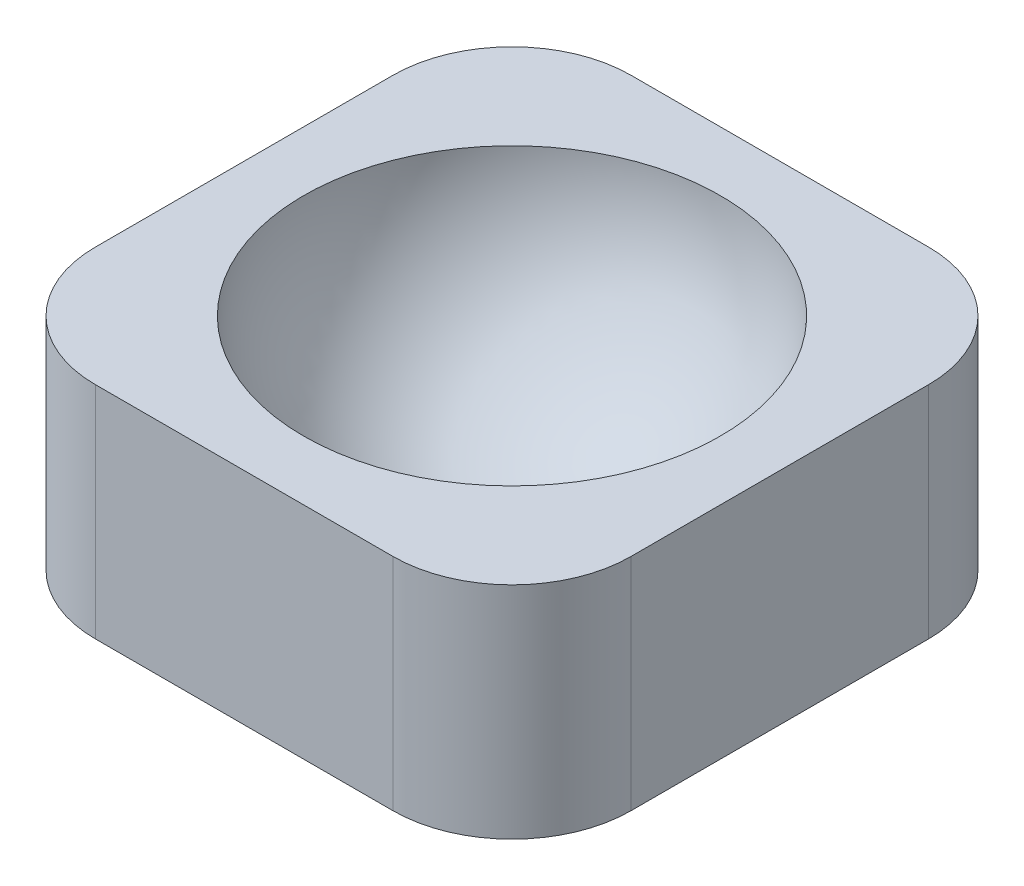
ISO-10303-21;
HEADER;
FILE_DESCRIPTION(('STEP AP214'),'2;1');
FILE_NAME('part.step','',(''),(''),'','','');
FILE_SCHEMA(('AUTOMOTIVE_DESIGN { 1 0 10303 214 1 1 1 1 }'));
ENDSEC;
DATA;
#1=APPLICATION_CONTEXT('core data for automotive mechanical design processes');
#2=APPLICATION_PROTOCOL_DEFINITION('international standard','automotive_design',2000,#1);
#3=PRODUCT_CONTEXT('',#1,'mechanical');
#4=PRODUCT('Part','Part','',(#3));
#5=PRODUCT_RELATED_PRODUCT_CATEGORY('part','',(#4));
#6=PRODUCT_DEFINITION_FORMATION('','',#4);
#7=PRODUCT_DEFINITION_CONTEXT('part definition',#1,'design');
#8=PRODUCT_DEFINITION('design','',#6,#7);
#9=PRODUCT_DEFINITION_SHAPE('','',#8);
#10=(LENGTH_UNIT() NAMED_UNIT(*) SI_UNIT(.MILLI.,.METRE.));
#11=(NAMED_UNIT(*) PLANE_ANGLE_UNIT() SI_UNIT($,.RADIAN.));
#12=(NAMED_UNIT(*) SI_UNIT($,.STERADIAN.) SOLID_ANGLE_UNIT());
#13=UNCERTAINTY_MEASURE_WITH_UNIT(LENGTH_MEASURE(1.E-05),#10,'distance_accuracy_value','');
#14=(GEOMETRIC_REPRESENTATION_CONTEXT(3) GLOBAL_UNCERTAINTY_ASSIGNED_CONTEXT((#13)) GLOBAL_UNIT_ASSIGNED_CONTEXT((#10,
#11,#12)) REPRESENTATION_CONTEXT('',''));
#15=CARTESIAN_POINT('',(0.,0.,0.));
#16=DIRECTION('',(0.,0.,1.));
#17=DIRECTION('',(1.,0.,0.));
#18=AXIS2_PLACEMENT_3D('',#15,#16,#17);
#19=CARTESIAN_POINT('',(-114.3,46.99,0.));
#20=DIRECTION('',(-1.,0.,0.));
#21=DIRECTION('',(0.,0.,1.));
#22=AXIS2_PLACEMENT_3D('',#19,#20,#21);
#23=PLANE('',#22);
#24=DIRECTION('',(0.,0.,-1.));
#25=VECTOR('',#24,1.);
#26=CARTESIAN_POINT('',(-114.3,0.,0.));
#27=LINE('',#26,#25);
#28=CARTESIAN_POINT('',(-114.3,0.,-25.4));
#29=VERTEX_POINT('',#28);
#30=CARTESIAN_POINT('',(-114.3,0.,-88.8999999999998));
#31=VERTEX_POINT('',#30);
#32=EDGE_CURVE('E132',#29,#31,#27,.T.);
#33=ORIENTED_EDGE('',*,*,#32,.F.);
#34=DIRECTION('',(0.,-1.,0.));
#35=VECTOR('',#34,1.);
#36=CARTESIAN_POINT('',(-114.3,46.99,-25.4));
#37=LINE('',#36,#35);
#38=CARTESIAN_POINT('',(-114.3,46.99,-25.4));
#39=VERTEX_POINT('',#38);
#40=EDGE_CURVE('E155',#29,#39,#37,.F.);
#41=ORIENTED_EDGE('',*,*,#40,.T.);
#42=DIRECTION('',(0.,0.,-1.));
#43=VECTOR('',#42,1.);
#44=CARTESIAN_POINT('',(-114.3,46.99,0.));
#45=LINE('',#44,#43);
#46=CARTESIAN_POINT('',(-114.3,46.99,-88.8999999999998));
#47=VERTEX_POINT('',#46);
#48=EDGE_CURVE('E130',#39,#47,#45,.T.);
#49=ORIENTED_EDGE('',*,*,#48,.T.);
#50=DIRECTION('',(0.,-1.,0.));
#51=VECTOR('',#50,1.);
#52=CARTESIAN_POINT('',(-114.3,0.,-88.8999999999998));
#53=LINE('',#52,#51);
#54=EDGE_CURVE('E152',#47,#31,#53,.T.);
#55=ORIENTED_EDGE('',*,*,#54,.T.);
#56=EDGE_LOOP('',(#33,#41,#49,#55));
#57=FACE_BOUND('',#56,.T.);
#58=ADVANCED_FACE('F37',(#57),#23,.T.);
#59=CARTESIAN_POINT('',(0.,46.99,0.));
#60=DIRECTION('',(0.,0.,1.));
#61=DIRECTION('',(1.,0.,0.));
#62=AXIS2_PLACEMENT_3D('',#59,#60,#61);
#63=PLANE('',#62);
#64=DIRECTION('',(-1.,0.,0.));
#65=VECTOR('',#64,1.);
#66=CARTESIAN_POINT('',(0.,0.,0.));
#67=LINE('',#66,#65);
#68=CARTESIAN_POINT('',(-25.4,0.,0.));
#69=VERTEX_POINT('',#68);
#70=CARTESIAN_POINT('',(-88.9000000000001,0.,0.));
#71=VERTEX_POINT('',#70);
#72=EDGE_CURVE('E128',#69,#71,#67,.T.);
#73=ORIENTED_EDGE('',*,*,#72,.F.);
#74=DIRECTION('',(0.,-1.,0.));
#75=VECTOR('',#74,1.);
#76=CARTESIAN_POINT('',(-25.4,46.99,0.));
#77=LINE('',#76,#75);
#78=CARTESIAN_POINT('',(-25.4,46.99,0.));
#79=VERTEX_POINT('',#78);
#80=EDGE_CURVE('E107',#69,#79,#77,.F.);
#81=ORIENTED_EDGE('',*,*,#80,.T.);
#82=DIRECTION('',(-1.,0.,0.));
#83=VECTOR('',#82,1.);
#84=CARTESIAN_POINT('',(0.,46.99,0.));
#85=LINE('',#84,#83);
#86=CARTESIAN_POINT('',(-88.9000000000001,46.99,0.));
#87=VERTEX_POINT('',#86);
#88=EDGE_CURVE('E171',#79,#87,#85,.T.);
#89=ORIENTED_EDGE('',*,*,#88,.T.);
#90=DIRECTION('',(0.,-1.,0.));
#91=VECTOR('',#90,1.);
#92=CARTESIAN_POINT('',(-88.9000000000001,46.99,0.));
#93=LINE('',#92,#91);
#94=EDGE_CURVE('E112',#87,#71,#93,.T.);
#95=ORIENTED_EDGE('',*,*,#94,.T.);
#96=EDGE_LOOP('',(#73,#81,#89,#95));
#97=FACE_BOUND('',#96,.T.);
#98=ADVANCED_FACE('F196',(#97),#63,.T.);
#99=CARTESIAN_POINT('',(0.,46.99,0.));
#100=DIRECTION('',(-1.,0.,0.));
#101=DIRECTION('',(0.,0.,1.));
#102=AXIS2_PLACEMENT_3D('',#99,#100,#101);
#103=PLANE('',#102);
#104=DIRECTION('',(0.,0.,-1.));
#105=VECTOR('',#104,1.);
#106=CARTESIAN_POINT('',(0.,46.99,0.));
#107=LINE('',#106,#105);
#108=CARTESIAN_POINT('',(0.,46.99,-25.4));
#109=VERTEX_POINT('',#108);
#110=CARTESIAN_POINT('',(0.,46.99,-88.8999999999999));
#111=VERTEX_POINT('',#110);
#112=EDGE_CURVE('E121',#109,#111,#107,.T.);
#113=ORIENTED_EDGE('',*,*,#112,.F.);
#114=DIRECTION('',(0.,-1.,0.));
#115=VECTOR('',#114,1.);
#116=CARTESIAN_POINT('',(0.,0.,-25.4));
#117=LINE('',#116,#115);
#118=CARTESIAN_POINT('',(0.,0.,-25.4));
#119=VERTEX_POINT('',#118);
#120=EDGE_CURVE('E106',#109,#119,#117,.T.);
#121=ORIENTED_EDGE('',*,*,#120,.T.);
#122=DIRECTION('',(0.,0.,-1.));
#123=VECTOR('',#122,1.);
#124=CARTESIAN_POINT('',(0.,0.,0.));
#125=LINE('',#124,#123);
#126=CARTESIAN_POINT('',(0.,0.,-88.8999999999999));
#127=VERTEX_POINT('',#126);
#128=EDGE_CURVE('E119',#119,#127,#125,.T.);
#129=ORIENTED_EDGE('',*,*,#128,.T.);
#130=DIRECTION('',(0.,-1.,0.));
#131=VECTOR('',#130,1.);
#132=CARTESIAN_POINT('',(0.,46.99,-88.8999999999999));
#133=LINE('',#132,#131);
#134=EDGE_CURVE('E123',#127,#111,#133,.F.);
#135=ORIENTED_EDGE('',*,*,#134,.T.);
#136=EDGE_LOOP('',(#113,#121,#129,#135));
#137=FACE_BOUND('',#136,.T.);
#138=ADVANCED_FACE('F118',(#137),#103,.F.);
#139=CARTESIAN_POINT('',(-1.52655665885959E-13,46.99,-114.3));
#140=DIRECTION('',(0.,0.,1.));
#141=DIRECTION('',(1.,0.,0.));
#142=AXIS2_PLACEMENT_3D('',#139,#140,#141);
#143=PLANE('',#142);
#144=DIRECTION('',(-1.,0.,0.));
#145=VECTOR('',#144,1.);
#146=CARTESIAN_POINT('',(-1.52655665885959E-13,0.,-114.3));
#147=LINE('',#146,#145);
#148=CARTESIAN_POINT('',(-25.4,0.,-114.3));
#149=VERTEX_POINT('',#148);
#150=CARTESIAN_POINT('',(-88.9000000000001,0.,-114.3));
#151=VERTEX_POINT('',#150);
#152=EDGE_CURVE('E127',#149,#151,#147,.T.);
#153=ORIENTED_EDGE('',*,*,#152,.T.);
#154=DIRECTION('',(0.,-1.,0.));
#155=VECTOR('',#154,1.);
#156=CARTESIAN_POINT('',(-88.9000000000001,46.99,-114.3));
#157=LINE('',#156,#155);
#158=CARTESIAN_POINT('',(-88.9000000000001,46.99,-114.3));
#159=VERTEX_POINT('',#158);
#160=EDGE_CURVE('E11',#151,#159,#157,.F.);
#161=ORIENTED_EDGE('',*,*,#160,.T.);
#162=DIRECTION('',(-1.,0.,0.));
#163=VECTOR('',#162,1.);
#164=CARTESIAN_POINT('',(-1.52655665885959E-13,46.99,-114.3));
#165=LINE('',#164,#163);
#166=CARTESIAN_POINT('',(-25.4,46.99,-114.3));
#167=VERTEX_POINT('',#166);
#168=EDGE_CURVE('E136',#167,#159,#165,.T.);
#169=ORIENTED_EDGE('',*,*,#168,.F.);
#170=DIRECTION('',(0.,-1.,0.));
#171=VECTOR('',#170,1.);
#172=CARTESIAN_POINT('',(-25.4,46.99,-114.3));
#173=LINE('',#172,#171);
#174=EDGE_CURVE('E45',#167,#149,#173,.T.);
#175=ORIENTED_EDGE('',*,*,#174,.T.);
#176=EDGE_LOOP('',(#153,#161,#169,#175));
#177=FACE_BOUND('',#176,.T.);
#178=ADVANCED_FACE('F158',(#177),#143,.F.);
#179=CARTESIAN_POINT('',(0.,46.99,0.));
#180=DIRECTION('',(0.,1.,0.));
#181=DIRECTION('',(0.,0.,1.));
#182=AXIS2_PLACEMENT_3D('',#179,#180,#181);
#183=PLANE('',#182);
#184=CARTESIAN_POINT('',(-57.15,46.99,-57.15));
#185=DIRECTION('',(0.,-1.,0.));
#186=DIRECTION('',(0.,0.,1.));
#187=AXIS2_PLACEMENT_3D('',#184,#185,#186);
#188=CIRCLE('',#187,44.45);
#189=CARTESIAN_POINT('',(-57.15,46.99,-12.7));
#190=VERTEX_POINT('',#189);
#191=EDGE_CURVE('E176',#190,#190,#188,.T.);
#192=ORIENTED_EDGE('',*,*,#191,.T.);
#193=EDGE_LOOP('',(#192));
#194=FACE_BOUND('',#193,.T.);
#195=ORIENTED_EDGE('',*,*,#88,.F.);
#196=CARTESIAN_POINT('',(-25.4,46.99,-25.4));
#197=DIRECTION('',(0.,1.,0.));
#198=DIRECTION('',(0.,0.,1.));
#199=AXIS2_PLACEMENT_3D('',#196,#197,#198);
#200=CIRCLE('',#199,25.4);
#201=EDGE_CURVE('E150',#79,#109,#200,.T.);
#202=ORIENTED_EDGE('',*,*,#201,.T.);
#203=ORIENTED_EDGE('',*,*,#112,.T.);
#204=CARTESIAN_POINT('',(-25.4,46.99,-88.8999999999999));
#205=DIRECTION('',(0.,1.,0.));
#206=DIRECTION('',(0.,0.,1.));
#207=AXIS2_PLACEMENT_3D('',#204,#205,#206);
#208=CIRCLE('',#207,25.4);
#209=EDGE_CURVE('E57',#111,#167,#208,.T.);
#210=ORIENTED_EDGE('',*,*,#209,.T.);
#211=ORIENTED_EDGE('',*,*,#168,.T.);
#212=CARTESIAN_POINT('',(-88.9000000000001,46.99,-88.8999999999998));
#213=DIRECTION('',(0.,1.,0.));
#214=DIRECTION('',(0.,0.,1.));
#215=AXIS2_PLACEMENT_3D('',#212,#213,#214);
#216=CIRCLE('',#215,25.4);
#217=EDGE_CURVE('E146',#159,#47,#216,.T.);
#218=ORIENTED_EDGE('',*,*,#217,.T.);
#219=ORIENTED_EDGE('',*,*,#48,.F.);
#220=CARTESIAN_POINT('',(-88.9000000000001,46.99,-25.4));
#221=DIRECTION('',(0.,1.,0.));
#222=DIRECTION('',(0.,0.,1.));
#223=AXIS2_PLACEMENT_3D('',#220,#221,#222);
#224=CIRCLE('',#223,25.4);
#225=EDGE_CURVE('E148',#39,#87,#224,.T.);
#226=ORIENTED_EDGE('',*,*,#225,.T.);
#227=EDGE_LOOP('',(#195,#202,#203,#210,#211,#218,#219,#226));
#228=FACE_BOUND('',#227,.T.);
#229=ADVANCED_FACE('F182',(#194,#228),#183,.T.);
#230=CARTESIAN_POINT('',(0.,0.,0.));
#231=DIRECTION('',(0.,1.,0.));
#232=DIRECTION('',(0.,0.,1.));
#233=AXIS2_PLACEMENT_3D('',#230,#231,#232);
#234=PLANE('',#233);
#235=ORIENTED_EDGE('',*,*,#128,.F.);
#236=CARTESIAN_POINT('',(-25.4,0.,-25.4));
#237=DIRECTION('',(0.,1.,0.));
#238=DIRECTION('',(0.,0.,1.));
#239=AXIS2_PLACEMENT_3D('',#236,#237,#238);
#240=CIRCLE('',#239,25.4);
#241=EDGE_CURVE('E102',#119,#69,#240,.F.);
#242=ORIENTED_EDGE('',*,*,#241,.T.);
#243=ORIENTED_EDGE('',*,*,#72,.T.);
#244=CARTESIAN_POINT('',(-88.9000000000001,0.,-25.4));
#245=DIRECTION('',(0.,1.,0.));
#246=DIRECTION('',(0.,0.,1.));
#247=AXIS2_PLACEMENT_3D('',#244,#245,#246);
#248=CIRCLE('',#247,25.4);
#249=EDGE_CURVE('E113',#71,#29,#248,.F.);
#250=ORIENTED_EDGE('',*,*,#249,.T.);
#251=ORIENTED_EDGE('',*,*,#32,.T.);
#252=CARTESIAN_POINT('',(-88.9000000000001,0.,-88.8999999999998));
#253=DIRECTION('',(0.,1.,0.));
#254=DIRECTION('',(0.,0.,1.));
#255=AXIS2_PLACEMENT_3D('',#252,#253,#254);
#256=CIRCLE('',#255,25.4);
#257=EDGE_CURVE('E139',#31,#151,#256,.F.);
#258=ORIENTED_EDGE('',*,*,#257,.T.);
#259=ORIENTED_EDGE('',*,*,#152,.F.);
#260=CARTESIAN_POINT('',(-25.4,0.,-88.8999999999999));
#261=DIRECTION('',(0.,1.,0.));
#262=DIRECTION('',(0.,0.,1.));
#263=AXIS2_PLACEMENT_3D('',#260,#261,#262);
#264=CIRCLE('',#263,25.4);
#265=EDGE_CURVE('E122',#149,#127,#264,.F.);
#266=ORIENTED_EDGE('',*,*,#265,.T.);
#267=EDGE_LOOP('',(#235,#242,#243,#250,#251,#258,#259,#266));
#268=FACE_BOUND('',#267,.T.);
#269=ADVANCED_FACE('F125',(#268),#234,.F.);
#270=CARTESIAN_POINT('',(-57.15,46.99,-57.15));
#271=DIRECTION('',(0.,0.,1.));
#272=DIRECTION('',(1.,0.,0.));
#273=AXIS2_PLACEMENT_3D('',#270,#271,#272);
#274=SPHERICAL_SURFACE('',#273,44.45);
#275=CARTESIAN_POINT('',(-57.15,46.99,-57.15));
#276=DIRECTION('',(0.,-1.,0.));
#277=DIRECTION('',(0.,0.,1.));
#278=AXIS2_PLACEMENT_3D('',#275,#276,#277);
#279=SPHERICAL_SURFACE('',#278,44.45);
#280=ORIENTED_EDGE('',*,*,#191,.F.);
#281=EDGE_LOOP('',(#280));
#282=FACE_BOUND('',#281,.T.);
#283=ADVANCED_FACE('F184',(#282),#279,.F.);
#284=CARTESIAN_POINT('',(-25.4,46.99,-25.4));
#285=DIRECTION('',(0.,1.,0.));
#286=DIRECTION('',(0.,0.,1.));
#287=AXIS2_PLACEMENT_3D('',#284,#285,#286);
#288=CYLINDRICAL_SURFACE('',#287,25.4);
#289=ORIENTED_EDGE('',*,*,#201,.F.);
#290=ORIENTED_EDGE('',*,*,#80,.F.);
#291=ORIENTED_EDGE('',*,*,#241,.F.);
#292=ORIENTED_EDGE('',*,*,#120,.F.);
#293=EDGE_LOOP('',(#289,#290,#291,#292));
#294=FACE_BOUND('',#293,.T.);
#295=ADVANCED_FACE('F105',(#294),#288,.T.);
#296=CARTESIAN_POINT('',(-88.9000000000001,46.99,-25.4));
#297=DIRECTION('',(0.,-1.,0.));
#298=DIRECTION('',(0.,0.,-1.));
#299=AXIS2_PLACEMENT_3D('',#296,#297,#298);
#300=CYLINDRICAL_SURFACE('',#299,25.4);
#301=ORIENTED_EDGE('',*,*,#225,.F.);
#302=ORIENTED_EDGE('',*,*,#40,.F.);
#303=ORIENTED_EDGE('',*,*,#249,.F.);
#304=ORIENTED_EDGE('',*,*,#94,.F.);
#305=EDGE_LOOP('',(#301,#302,#303,#304));
#306=FACE_BOUND('',#305,.T.);
#307=ADVANCED_FACE('F191',(#306),#300,.T.);
#308=CARTESIAN_POINT('',(-88.9000000000001,46.99,-88.8999999999998));
#309=DIRECTION('',(0.,1.,0.));
#310=DIRECTION('',(0.,0.,1.));
#311=AXIS2_PLACEMENT_3D('',#308,#309,#310);
#312=CYLINDRICAL_SURFACE('',#311,25.4);
#313=ORIENTED_EDGE('',*,*,#217,.F.);
#314=ORIENTED_EDGE('',*,*,#160,.F.);
#315=ORIENTED_EDGE('',*,*,#257,.F.);
#316=ORIENTED_EDGE('',*,*,#54,.F.);
#317=EDGE_LOOP('',(#313,#314,#315,#316));
#318=FACE_BOUND('',#317,.T.);
#319=ADVANCED_FACE('F165',(#318),#312,.T.);
#320=CARTESIAN_POINT('',(-25.4,46.99,-88.8999999999999));
#321=DIRECTION('',(0.,-1.,0.));
#322=DIRECTION('',(0.,0.,-1.));
#323=AXIS2_PLACEMENT_3D('',#320,#321,#322);
#324=CYLINDRICAL_SURFACE('',#323,25.4);
#325=ORIENTED_EDGE('',*,*,#209,.F.);
#326=ORIENTED_EDGE('',*,*,#134,.F.);
#327=ORIENTED_EDGE('',*,*,#265,.F.);
#328=ORIENTED_EDGE('',*,*,#174,.F.);
#329=EDGE_LOOP('',(#325,#326,#327,#328));
#330=FACE_BOUND('',#329,.T.);
#331=ADVANCED_FACE('F39',(#330),#324,.T.);
#332=CLOSED_SHELL('',(#58,#98,#138,#178,#229,#269,#283,#295,#307,#319,#331));
#333=MANIFOLD_SOLID_BREP('B2',#332);
#334=ADVANCED_BREP_SHAPE_REPRESENTATION('',(#18,#333),#14);
#335=SHAPE_DEFINITION_REPRESENTATION(#9,#334);
ENDSEC;
END-ISO-10303-21;
